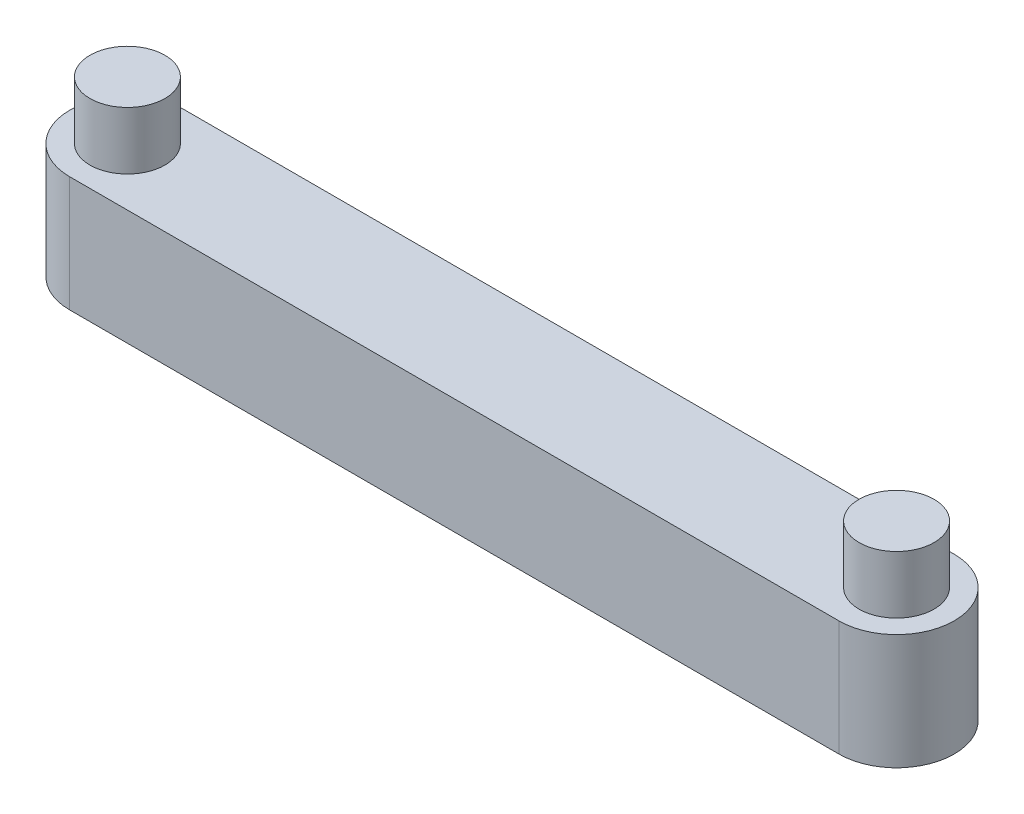
ISO-10303-21;
HEADER;
FILE_DESCRIPTION(('STEP AP214'),'2;1');
FILE_NAME('part.step','',(''),(''),'','','');
FILE_SCHEMA(('AUTOMOTIVE_DESIGN { 1 0 10303 214 1 1 1 1 }'));
ENDSEC;
DATA;
#1=APPLICATION_CONTEXT('core data for automotive mechanical design processes');
#2=APPLICATION_PROTOCOL_DEFINITION('international standard','automotive_design',2000,#1);
#3=PRODUCT_CONTEXT('',#1,'mechanical');
#4=PRODUCT('Part','Part','',(#3));
#5=PRODUCT_RELATED_PRODUCT_CATEGORY('part','',(#4));
#6=PRODUCT_DEFINITION_FORMATION('','',#4);
#7=PRODUCT_DEFINITION_CONTEXT('part definition',#1,'design');
#8=PRODUCT_DEFINITION('design','',#6,#7);
#9=PRODUCT_DEFINITION_SHAPE('','',#8);
#10=(LENGTH_UNIT() NAMED_UNIT(*) SI_UNIT(.MILLI.,.METRE.));
#11=(NAMED_UNIT(*) PLANE_ANGLE_UNIT() SI_UNIT($,.RADIAN.));
#12=(NAMED_UNIT(*) SI_UNIT($,.STERADIAN.) SOLID_ANGLE_UNIT());
#13=UNCERTAINTY_MEASURE_WITH_UNIT(LENGTH_MEASURE(1.E-05),#10,'distance_accuracy_value','');
#14=(GEOMETRIC_REPRESENTATION_CONTEXT(3) GLOBAL_UNCERTAINTY_ASSIGNED_CONTEXT((#13)) GLOBAL_UNIT_ASSIGNED_CONTEXT((#10,
#11,#12)) REPRESENTATION_CONTEXT('',''));
#15=CARTESIAN_POINT('',(0.,0.,0.));
#16=DIRECTION('',(0.,0.,1.));
#17=DIRECTION('',(1.,0.,0.));
#18=AXIS2_PLACEMENT_3D('',#15,#16,#17);
#19=CARTESIAN_POINT('',(-100.,-15.,0.));
#20=DIRECTION('',(0.,1.,0.));
#21=DIRECTION('',(0.,0.,1.));
#22=AXIS2_PLACEMENT_3D('',#19,#20,#21);
#23=CYLINDRICAL_SURFACE('',#22,9.74999999999999);
#24=CARTESIAN_POINT('',(-100.,-15.,0.));
#25=DIRECTION('',(0.,1.,0.));
#26=DIRECTION('',(0.,0.,1.));
#27=AXIS2_PLACEMENT_3D('',#24,#25,#26);
#28=CIRCLE('',#27,9.74999999999999);
#29=CARTESIAN_POINT('',(-100.,-15.,9.74999999999999));
#30=VERTEX_POINT('',#29);
#31=EDGE_CURVE('E118',#30,#30,#28,.T.);
#32=ORIENTED_EDGE('',*,*,#31,.F.);
#33=EDGE_LOOP('',(#32));
#34=FACE_BOUND('',#33,.T.);
#35=CARTESIAN_POINT('',(-100.,-3.,0.));
#36=DIRECTION('',(0.,1.,0.));
#37=DIRECTION('',(0.,0.,1.));
#38=AXIS2_PLACEMENT_3D('',#35,#36,#37);
#39=CIRCLE('',#38,9.74999999999999);
#40=CARTESIAN_POINT('',(-100.,-3.,9.74999999999999));
#41=VERTEX_POINT('',#40);
#42=EDGE_CURVE('E11',#41,#41,#39,.F.);
#43=ORIENTED_EDGE('',*,*,#42,.F.);
#44=EDGE_LOOP('',(#43));
#45=FACE_BOUND('',#44,.T.);
#46=ADVANCED_FACE('F37',(#34,#45),#23,.F.);
#47=CARTESIAN_POINT('',(100.,-15.,0.));
#48=DIRECTION('',(0.,1.,0.));
#49=DIRECTION('',(0.,0.,1.));
#50=AXIS2_PLACEMENT_3D('',#47,#48,#49);
#51=CYLINDRICAL_SURFACE('',#50,9.74999999999999);
#52=CARTESIAN_POINT('',(100.,-15.,0.));
#53=DIRECTION('',(0.,1.,0.));
#54=DIRECTION('',(0.,0.,1.));
#55=AXIS2_PLACEMENT_3D('',#52,#53,#54);
#56=CIRCLE('',#55,9.74999999999999);
#57=CARTESIAN_POINT('',(100.,-15.,9.74999999999999));
#58=VERTEX_POINT('',#57);
#59=EDGE_CURVE('E108',#58,#58,#56,.T.);
#60=ORIENTED_EDGE('',*,*,#59,.F.);
#61=EDGE_LOOP('',(#60));
#62=FACE_BOUND('',#61,.T.);
#63=CARTESIAN_POINT('',(100.,-3.,0.));
#64=DIRECTION('',(0.,1.,0.));
#65=DIRECTION('',(0.,0.,1.));
#66=AXIS2_PLACEMENT_3D('',#63,#64,#65);
#67=CIRCLE('',#66,9.74999999999999);
#68=CARTESIAN_POINT('',(100.,-3.,9.74999999999999));
#69=VERTEX_POINT('',#68);
#70=EDGE_CURVE('E46',#69,#69,#67,.F.);
#71=ORIENTED_EDGE('',*,*,#70,.F.);
#72=EDGE_LOOP('',(#71));
#73=FACE_BOUND('',#72,.T.);
#74=ADVANCED_FACE('F128',(#62,#73),#51,.F.);
#75=CARTESIAN_POINT('',(-100.,15.,0.));
#76=DIRECTION('',(0.,-1.,0.));
#77=DIRECTION('',(0.,0.,-1.));
#78=AXIS2_PLACEMENT_3D('',#75,#76,#77);
#79=CYLINDRICAL_SURFACE('',#78,15.);
#80=CARTESIAN_POINT('',(-100.,-15.,0.));
#81=DIRECTION('',(0.,1.,0.));
#82=DIRECTION('',(0.,0.,1.));
#83=AXIS2_PLACEMENT_3D('',#80,#81,#82);
#84=CIRCLE('',#83,15.);
#85=CARTESIAN_POINT('',(-100.,-15.,-15.));
#86=VERTEX_POINT('',#85);
#87=CARTESIAN_POINT('',(-100.,-15.,15.));
#88=VERTEX_POINT('',#87);
#89=EDGE_CURVE('E105',#86,#88,#84,.T.);
#90=ORIENTED_EDGE('',*,*,#89,.T.);
#91=DIRECTION('',(0.,-1.,0.));
#92=VECTOR('',#91,1.);
#93=CARTESIAN_POINT('',(-100.,15.,15.));
#94=LINE('',#93,#92);
#95=CARTESIAN_POINT('',(-100.,15.,15.));
#96=VERTEX_POINT('',#95);
#97=EDGE_CURVE('E96',#96,#88,#94,.T.);
#98=ORIENTED_EDGE('',*,*,#97,.F.);
#99=CARTESIAN_POINT('',(-100.,15.,0.));
#100=DIRECTION('',(0.,1.,0.));
#101=DIRECTION('',(0.,0.,1.));
#102=AXIS2_PLACEMENT_3D('',#99,#100,#101);
#103=CIRCLE('',#102,15.);
#104=CARTESIAN_POINT('',(-100.,15.,-15.));
#105=VERTEX_POINT('',#104);
#106=EDGE_CURVE('E90',#105,#96,#103,.T.);
#107=ORIENTED_EDGE('',*,*,#106,.F.);
#108=DIRECTION('',(0.,-1.,0.));
#109=VECTOR('',#108,1.);
#110=CARTESIAN_POINT('',(-100.,15.,-15.));
#111=LINE('',#110,#109);
#112=EDGE_CURVE('E101',#105,#86,#111,.T.);
#113=ORIENTED_EDGE('',*,*,#112,.T.);
#114=EDGE_LOOP('',(#90,#98,#107,#113));
#115=FACE_BOUND('',#114,.T.);
#116=ADVANCED_FACE('F39',(#115),#79,.T.);
#117=CARTESIAN_POINT('',(-100.,15.,15.));
#118=DIRECTION('',(0.,0.,-1.));
#119=DIRECTION('',(-1.,0.,0.));
#120=AXIS2_PLACEMENT_3D('',#117,#118,#119);
#121=PLANE('',#120);
#122=DIRECTION('',(1.,0.,0.));
#123=VECTOR('',#122,1.);
#124=CARTESIAN_POINT('',(-100.,-15.,15.));
#125=LINE('',#124,#123);
#126=CARTESIAN_POINT('',(100.,-15.,15.));
#127=VERTEX_POINT('',#126);
#128=EDGE_CURVE('E95',#88,#127,#125,.T.);
#129=ORIENTED_EDGE('',*,*,#128,.T.);
#130=DIRECTION('',(0.,-1.,0.));
#131=VECTOR('',#130,1.);
#132=CARTESIAN_POINT('',(100.,15.,15.));
#133=LINE('',#132,#131);
#134=CARTESIAN_POINT('',(100.,15.,15.));
#135=VERTEX_POINT('',#134);
#136=EDGE_CURVE('E93',#135,#127,#133,.T.);
#137=ORIENTED_EDGE('',*,*,#136,.F.);
#138=DIRECTION('',(1.,0.,0.));
#139=VECTOR('',#138,1.);
#140=CARTESIAN_POINT('',(-100.,15.,15.));
#141=LINE('',#140,#139);
#142=EDGE_CURVE('E85',#96,#135,#141,.T.);
#143=ORIENTED_EDGE('',*,*,#142,.F.);
#144=ORIENTED_EDGE('',*,*,#97,.T.);
#145=EDGE_LOOP('',(#129,#137,#143,#144));
#146=FACE_BOUND('',#145,.T.);
#147=ADVANCED_FACE('F94',(#146),#121,.F.);
#148=CARTESIAN_POINT('',(100.,15.,0.));
#149=DIRECTION('',(0.,-1.,0.));
#150=DIRECTION('',(0.,0.,-1.));
#151=AXIS2_PLACEMENT_3D('',#148,#149,#150);
#152=CYLINDRICAL_SURFACE('',#151,15.);
#153=CARTESIAN_POINT('',(100.,-15.,0.));
#154=DIRECTION('',(0.,1.,0.));
#155=DIRECTION('',(0.,0.,1.));
#156=AXIS2_PLACEMENT_3D('',#153,#154,#155);
#157=CIRCLE('',#156,15.);
#158=CARTESIAN_POINT('',(100.,-15.,-15.));
#159=VERTEX_POINT('',#158);
#160=EDGE_CURVE('E71',#127,#159,#157,.T.);
#161=ORIENTED_EDGE('',*,*,#160,.T.);
#162=DIRECTION('',(0.,-1.,0.));
#163=VECTOR('',#162,1.);
#164=CARTESIAN_POINT('',(100.,15.,-15.));
#165=LINE('',#164,#163);
#166=CARTESIAN_POINT('',(100.,15.,-15.));
#167=VERTEX_POINT('',#166);
#168=EDGE_CURVE('E97',#167,#159,#165,.T.);
#169=ORIENTED_EDGE('',*,*,#168,.F.);
#170=CARTESIAN_POINT('',(100.,15.,0.));
#171=DIRECTION('',(0.,1.,0.));
#172=DIRECTION('',(0.,0.,1.));
#173=AXIS2_PLACEMENT_3D('',#170,#171,#172);
#174=CIRCLE('',#173,15.);
#175=EDGE_CURVE('E88',#135,#167,#174,.T.);
#176=ORIENTED_EDGE('',*,*,#175,.F.);
#177=ORIENTED_EDGE('',*,*,#136,.T.);
#178=EDGE_LOOP('',(#161,#169,#176,#177));
#179=FACE_BOUND('',#178,.T.);
#180=ADVANCED_FACE('F99',(#179),#152,.T.);
#181=CARTESIAN_POINT('',(-100.,15.,-15.));
#182=DIRECTION('',(0.,0.,1.));
#183=DIRECTION('',(1.,0.,0.));
#184=AXIS2_PLACEMENT_3D('',#181,#182,#183);
#185=PLANE('',#184);
#186=DIRECTION('',(-1.,0.,0.));
#187=VECTOR('',#186,1.);
#188=CARTESIAN_POINT('',(-100.,-15.,-15.));
#189=LINE('',#188,#187);
#190=EDGE_CURVE('E77',#159,#86,#189,.T.);
#191=ORIENTED_EDGE('',*,*,#190,.T.);
#192=ORIENTED_EDGE('',*,*,#112,.F.);
#193=DIRECTION('',(-1.,0.,0.));
#194=VECTOR('',#193,1.);
#195=CARTESIAN_POINT('',(-100.,15.,-15.));
#196=LINE('',#195,#194);
#197=EDGE_CURVE('E54',#167,#105,#196,.T.);
#198=ORIENTED_EDGE('',*,*,#197,.F.);
#199=ORIENTED_EDGE('',*,*,#168,.T.);
#200=EDGE_LOOP('',(#191,#192,#198,#199));
#201=FACE_BOUND('',#200,.T.);
#202=ADVANCED_FACE('F147',(#201),#185,.F.);
#203=CARTESIAN_POINT('',(-100.,15.,0.));
#204=DIRECTION('',(0.,1.,0.));
#205=DIRECTION('',(0.,0.,1.));
#206=AXIS2_PLACEMENT_3D('',#203,#204,#205);
#207=PLANE('',#206);
#208=CARTESIAN_POINT('',(-100.,15.,0.));
#209=DIRECTION('',(0.,1.,0.));
#210=DIRECTION('',(0.,0.,1.));
#211=AXIS2_PLACEMENT_3D('',#208,#209,#210);
#212=CIRCLE('',#211,9.74999999999999);
#213=CARTESIAN_POINT('',(-100.,15.,9.74999999999999));
#214=VERTEX_POINT('',#213);
#215=EDGE_CURVE('E120',#214,#214,#212,.F.);
#216=ORIENTED_EDGE('',*,*,#215,.T.);
#217=EDGE_LOOP('',(#216));
#218=FACE_BOUND('',#217,.T.);
#219=CARTESIAN_POINT('',(100.,15.,0.));
#220=DIRECTION('',(0.,1.,0.));
#221=DIRECTION('',(0.,0.,1.));
#222=AXIS2_PLACEMENT_3D('',#219,#220,#221);
#223=CIRCLE('',#222,9.74999999999999);
#224=CARTESIAN_POINT('',(100.,15.,9.74999999999999));
#225=VERTEX_POINT('',#224);
#226=EDGE_CURVE('E115',#225,#225,#223,.F.);
#227=ORIENTED_EDGE('',*,*,#226,.T.);
#228=EDGE_LOOP('',(#227));
#229=FACE_BOUND('',#228,.T.);
#230=ORIENTED_EDGE('',*,*,#106,.T.);
#231=ORIENTED_EDGE('',*,*,#142,.T.);
#232=ORIENTED_EDGE('',*,*,#175,.T.);
#233=ORIENTED_EDGE('',*,*,#197,.T.);
#234=EDGE_LOOP('',(#230,#231,#232,#233));
#235=FACE_BOUND('',#234,.T.);
#236=ADVANCED_FACE('F86',(#218,#229,#235),#207,.T.);
#237=CARTESIAN_POINT('',(-100.,-15.,0.));
#238=DIRECTION('',(0.,1.,0.));
#239=DIRECTION('',(0.,0.,1.));
#240=AXIS2_PLACEMENT_3D('',#237,#238,#239);
#241=PLANE('',#240);
#242=ORIENTED_EDGE('',*,*,#59,.T.);
#243=EDGE_LOOP('',(#242));
#244=FACE_BOUND('',#243,.T.);
#245=ORIENTED_EDGE('',*,*,#31,.T.);
#246=EDGE_LOOP('',(#245));
#247=FACE_BOUND('',#246,.T.);
#248=ORIENTED_EDGE('',*,*,#89,.F.);
#249=ORIENTED_EDGE('',*,*,#190,.F.);
#250=ORIENTED_EDGE('',*,*,#160,.F.);
#251=ORIENTED_EDGE('',*,*,#128,.F.);
#252=EDGE_LOOP('',(#248,#249,#250,#251));
#253=FACE_BOUND('',#252,.T.);
#254=ADVANCED_FACE('F146',(#244,#247,#253),#241,.F.);
#255=CARTESIAN_POINT('',(100.,30.,0.));
#256=DIRECTION('',(0.,-1.,0.));
#257=DIRECTION('',(0.,0.,-1.));
#258=AXIS2_PLACEMENT_3D('',#255,#256,#257);
#259=CYLINDRICAL_SURFACE('',#258,9.74999999999999);
#260=ORIENTED_EDGE('',*,*,#226,.F.);
#261=EDGE_LOOP('',(#260));
#262=FACE_BOUND('',#261,.T.);
#263=CARTESIAN_POINT('',(100.,30.,0.));
#264=DIRECTION('',(0.,1.,0.));
#265=DIRECTION('',(0.,0.,1.));
#266=AXIS2_PLACEMENT_3D('',#263,#264,#265);
#267=CIRCLE('',#266,9.74999999999999);
#268=CARTESIAN_POINT('',(100.,30.,9.74999999999999));
#269=VERTEX_POINT('',#268);
#270=EDGE_CURVE('E119',#269,#269,#267,.T.);
#271=ORIENTED_EDGE('',*,*,#270,.F.);
#272=EDGE_LOOP('',(#271));
#273=FACE_BOUND('',#272,.T.);
#274=ADVANCED_FACE('F141',(#262,#273),#259,.T.);
#275=CARTESIAN_POINT('',(100.,30.,0.));
#276=DIRECTION('',(0.,1.,0.));
#277=DIRECTION('',(0.,0.,1.));
#278=AXIS2_PLACEMENT_3D('',#275,#276,#277);
#279=PLANE('',#278);
#280=ORIENTED_EDGE('',*,*,#270,.T.);
#281=EDGE_LOOP('',(#280));
#282=FACE_BOUND('',#281,.T.);
#283=ADVANCED_FACE('F182',(#282),#279,.T.);
#284=CARTESIAN_POINT('',(-100.,30.,0.));
#285=DIRECTION('',(0.,-1.,0.));
#286=DIRECTION('',(0.,0.,-1.));
#287=AXIS2_PLACEMENT_3D('',#284,#285,#286);
#288=CYLINDRICAL_SURFACE('',#287,9.74999999999999);
#289=ORIENTED_EDGE('',*,*,#215,.F.);
#290=EDGE_LOOP('',(#289));
#291=FACE_BOUND('',#290,.T.);
#292=CARTESIAN_POINT('',(-100.,30.,0.));
#293=DIRECTION('',(0.,1.,0.));
#294=DIRECTION('',(0.,0.,1.));
#295=AXIS2_PLACEMENT_3D('',#292,#293,#294);
#296=CIRCLE('',#295,9.74999999999999);
#297=CARTESIAN_POINT('',(-100.,30.,9.74999999999999));
#298=VERTEX_POINT('',#297);
#299=EDGE_CURVE('E122',#298,#298,#296,.T.);
#300=ORIENTED_EDGE('',*,*,#299,.F.);
#301=EDGE_LOOP('',(#300));
#302=FACE_BOUND('',#301,.T.);
#303=ADVANCED_FACE('F189',(#291,#302),#288,.T.);
#304=CARTESIAN_POINT('',(-100.,30.,0.));
#305=DIRECTION('',(0.,1.,0.));
#306=DIRECTION('',(0.,0.,1.));
#307=AXIS2_PLACEMENT_3D('',#304,#305,#306);
#308=PLANE('',#307);
#309=ORIENTED_EDGE('',*,*,#299,.T.);
#310=EDGE_LOOP('',(#309));
#311=FACE_BOUND('',#310,.T.);
#312=ADVANCED_FACE('F196',(#311),#308,.T.);
#313=CARTESIAN_POINT('',(100.,-3.,0.));
#314=DIRECTION('',(0.,1.,0.));
#315=DIRECTION('',(0.,0.,1.));
#316=AXIS2_PLACEMENT_3D('',#313,#314,#315);
#317=PLANE('',#316);
#318=ORIENTED_EDGE('',*,*,#70,.T.);
#319=EDGE_LOOP('',(#318));
#320=FACE_BOUND('',#319,.T.);
#321=ADVANCED_FACE('F126',(#320),#317,.F.);
#322=CARTESIAN_POINT('',(-100.,-3.,0.));
#323=DIRECTION('',(0.,1.,0.));
#324=DIRECTION('',(0.,0.,1.));
#325=AXIS2_PLACEMENT_3D('',#322,#323,#324);
#326=PLANE('',#325);
#327=ORIENTED_EDGE('',*,*,#42,.T.);
#328=EDGE_LOOP('',(#327));
#329=FACE_BOUND('',#328,.T.);
#330=ADVANCED_FACE('F212',(#329),#326,.F.);
#331=CLOSED_SHELL('',(#46,#74,#116,#147,#180,#202,#236,#254,#274,#283,#303,#312,#321,#330));
#332=MANIFOLD_SOLID_BREP('B2',#331);
#333=ADVANCED_BREP_SHAPE_REPRESENTATION('',(#18,#332),#14);
#334=SHAPE_DEFINITION_REPRESENTATION(#9,#333);
ENDSEC;
END-ISO-10303-21;
